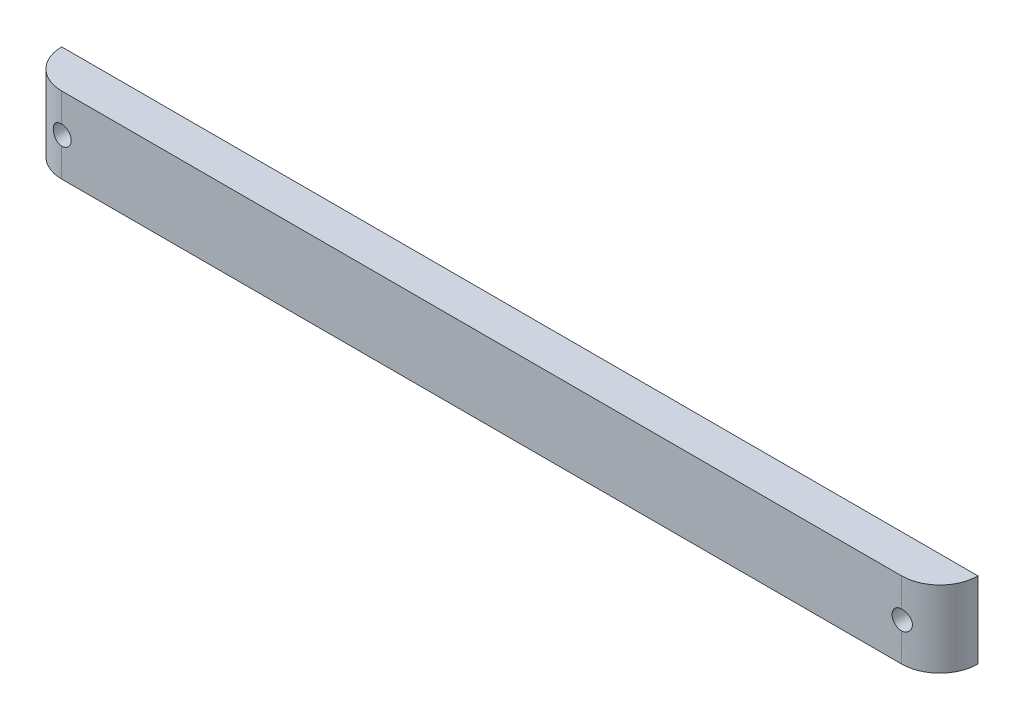
ISO-10303-21;
HEADER;
FILE_DESCRIPTION(('STEP AP214'),'2;1');
FILE_NAME('part.step','',(''),(''),'','','');
FILE_SCHEMA(('AUTOMOTIVE_DESIGN { 1 0 10303 214 1 1 1 1 }'));
ENDSEC;
DATA;
#1=APPLICATION_CONTEXT('core data for automotive mechanical design processes');
#2=APPLICATION_PROTOCOL_DEFINITION('international standard','automotive_design',2000,#1);
#3=PRODUCT_CONTEXT('',#1,'mechanical');
#4=PRODUCT('Part','Part','',(#3));
#5=PRODUCT_RELATED_PRODUCT_CATEGORY('part','',(#4));
#6=PRODUCT_DEFINITION_FORMATION('','',#4);
#7=PRODUCT_DEFINITION_CONTEXT('part definition',#1,'design');
#8=PRODUCT_DEFINITION('design','',#6,#7);
#9=PRODUCT_DEFINITION_SHAPE('','',#8);
#10=(LENGTH_UNIT() NAMED_UNIT(*) SI_UNIT(.MILLI.,.METRE.));
#11=(NAMED_UNIT(*) PLANE_ANGLE_UNIT() SI_UNIT($,.RADIAN.));
#12=(NAMED_UNIT(*) SI_UNIT($,.STERADIAN.) SOLID_ANGLE_UNIT());
#13=UNCERTAINTY_MEASURE_WITH_UNIT(LENGTH_MEASURE(1.E-05),#10,'distance_accuracy_value','');
#14=(GEOMETRIC_REPRESENTATION_CONTEXT(3) GLOBAL_UNCERTAINTY_ASSIGNED_CONTEXT((#13)) GLOBAL_UNIT_ASSIGNED_CONTEXT((#10,
#11,#12)) REPRESENTATION_CONTEXT('',''));
#15=CARTESIAN_POINT('',(0.,0.,0.));
#16=DIRECTION('',(0.,0.,1.));
#17=DIRECTION('',(1.,0.,0.));
#18=AXIS2_PLACEMENT_3D('',#15,#16,#17);
#19=CARTESIAN_POINT('',(0.,0.,10.));
#20=DIRECTION('',(0.,0.,-1.));
#21=DIRECTION('',(-1.,0.,0.));
#22=AXIS2_PLACEMENT_3D('',#19,#20,#21);
#23=PLANE('',#22);
#24=DIRECTION('',(1.,0.,0.));
#25=VECTOR('',#24,1.);
#26=CARTESIAN_POINT('',(0.,0.,10.));
#27=LINE('',#26,#25);
#28=CARTESIAN_POINT('',(10.,0.,10.));
#29=VERTEX_POINT('',#28);
#30=CARTESIAN_POINT('',(230.,0.,10.));
#31=VERTEX_POINT('',#30);
#32=EDGE_CURVE('E100',#29,#31,#27,.T.);
#33=ORIENTED_EDGE('',*,*,#32,.T.);
#34=DIRECTION('',(0.,1.,0.));
#35=VECTOR('',#34,1.);
#36=CARTESIAN_POINT('',(230.,0.,10.));
#37=LINE('',#36,#35);
#38=CARTESIAN_POINT('',(230.,7.50000000000001,10.));
#39=VERTEX_POINT('',#38);
#40=EDGE_CURVE('E134',#31,#39,#37,.T.);
#41=ORIENTED_EDGE('',*,*,#40,.T.);
#42=CARTESIAN_POINT('',(230.,10.,10.));
#43=DIRECTION('',(0.,0.,1.));
#44=DIRECTION('',(1.,0.,0.));
#45=AXIS2_PLACEMENT_3D('',#42,#43,#44);
#46=CIRCLE('',#45,2.5);
#47=CARTESIAN_POINT('',(230.,12.5,10.));
#48=VERTEX_POINT('',#47);
#49=EDGE_CURVE('E116',#48,#39,#46,.T.);
#50=ORIENTED_EDGE('',*,*,#49,.F.);
#51=DIRECTION('',(0.,1.,0.));
#52=VECTOR('',#51,1.);
#53=CARTESIAN_POINT('',(230.,0.,10.));
#54=LINE('',#53,#52);
#55=CARTESIAN_POINT('',(230.,20.,10.));
#56=VERTEX_POINT('',#55);
#57=EDGE_CURVE('E132',#48,#56,#54,.T.);
#58=ORIENTED_EDGE('',*,*,#57,.T.);
#59=DIRECTION('',(-1.,0.,0.));
#60=VECTOR('',#59,1.);
#61=CARTESIAN_POINT('',(0.,20.,10.));
#62=LINE('',#61,#60);
#63=CARTESIAN_POINT('',(10.,20.,10.));
#64=VERTEX_POINT('',#63);
#65=EDGE_CURVE('E122',#56,#64,#62,.T.);
#66=ORIENTED_EDGE('',*,*,#65,.T.);
#67=DIRECTION('',(0.,-1.,0.));
#68=VECTOR('',#67,1.);
#69=CARTESIAN_POINT('',(10.,0.,10.));
#70=LINE('',#69,#68);
#71=CARTESIAN_POINT('',(10.,12.5,10.));
#72=VERTEX_POINT('',#71);
#73=EDGE_CURVE('E130',#64,#72,#70,.T.);
#74=ORIENTED_EDGE('',*,*,#73,.T.);
#75=CARTESIAN_POINT('',(10.,10.,10.));
#76=DIRECTION('',(0.,0.,1.));
#77=DIRECTION('',(1.,0.,0.));
#78=AXIS2_PLACEMENT_3D('',#75,#76,#77);
#79=CIRCLE('',#78,2.5);
#80=CARTESIAN_POINT('',(10.,7.50000000000002,10.));
#81=VERTEX_POINT('',#80);
#82=EDGE_CURVE('E174',#81,#72,#79,.T.);
#83=ORIENTED_EDGE('',*,*,#82,.F.);
#84=DIRECTION('',(0.,-1.,0.));
#85=VECTOR('',#84,1.);
#86=CARTESIAN_POINT('',(10.,0.,10.));
#87=LINE('',#86,#85);
#88=EDGE_CURVE('E128',#81,#29,#87,.T.);
#89=ORIENTED_EDGE('',*,*,#88,.T.);
#90=EDGE_LOOP('',(#33,#41,#50,#58,#66,#74,#83,#89));
#91=FACE_BOUND('',#90,.T.);
#92=ADVANCED_FACE('F37',(#91),#23,.F.);
#93=CARTESIAN_POINT('',(0.,0.,0.));
#94=DIRECTION('',(0.,0.,-1.));
#95=DIRECTION('',(-1.,0.,0.));
#96=AXIS2_PLACEMENT_3D('',#93,#94,#95);
#97=PLANE('',#96);
#98=CARTESIAN_POINT('',(230.,10.,0.));
#99=DIRECTION('',(0.,0.,1.));
#100=DIRECTION('',(1.,0.,0.));
#101=AXIS2_PLACEMENT_3D('',#98,#99,#100);
#102=CIRCLE('',#101,2.5);
#103=CARTESIAN_POINT('',(232.5,10.,0.));
#104=VERTEX_POINT('',#103);
#105=EDGE_CURVE('E119',#104,#104,#102,.T.);
#106=ORIENTED_EDGE('',*,*,#105,.T.);
#107=EDGE_LOOP('',(#106));
#108=FACE_BOUND('',#107,.T.);
#109=DIRECTION('',(0.,-1.,0.));
#110=VECTOR('',#109,1.);
#111=CARTESIAN_POINT('',(0.,0.,0.));
#112=LINE('',#111,#110);
#113=CARTESIAN_POINT('',(0.,20.,0.));
#114=VERTEX_POINT('',#113);
#115=CARTESIAN_POINT('',(0.,0.,0.));
#116=VERTEX_POINT('',#115);
#117=EDGE_CURVE('E109',#114,#116,#112,.T.);
#118=ORIENTED_EDGE('',*,*,#117,.F.);
#119=DIRECTION('',(-1.,0.,0.));
#120=VECTOR('',#119,1.);
#121=CARTESIAN_POINT('',(0.,20.,0.));
#122=LINE('',#121,#120);
#123=CARTESIAN_POINT('',(240.,20.,0.));
#124=VERTEX_POINT('',#123);
#125=EDGE_CURVE('E126',#124,#114,#122,.T.);
#126=ORIENTED_EDGE('',*,*,#125,.F.);
#127=DIRECTION('',(0.,1.,0.));
#128=VECTOR('',#127,1.);
#129=CARTESIAN_POINT('',(240.,0.,0.));
#130=LINE('',#129,#128);
#131=CARTESIAN_POINT('',(240.,0.,0.));
#132=VERTEX_POINT('',#131);
#133=EDGE_CURVE('E112',#132,#124,#130,.T.);
#134=ORIENTED_EDGE('',*,*,#133,.F.);
#135=DIRECTION('',(1.,0.,0.));
#136=VECTOR('',#135,1.);
#137=CARTESIAN_POINT('',(0.,0.,0.));
#138=LINE('',#137,#136);
#139=EDGE_CURVE('E97',#116,#132,#138,.T.);
#140=ORIENTED_EDGE('',*,*,#139,.F.);
#141=EDGE_LOOP('',(#118,#126,#134,#140));
#142=FACE_BOUND('',#141,.T.);
#143=CARTESIAN_POINT('',(10.,10.,0.));
#144=DIRECTION('',(0.,0.,1.));
#145=DIRECTION('',(1.,0.,0.));
#146=AXIS2_PLACEMENT_3D('',#143,#144,#145);
#147=CIRCLE('',#146,2.5);
#148=CARTESIAN_POINT('',(12.5,10.,0.));
#149=VERTEX_POINT('',#148);
#150=EDGE_CURVE('E176',#149,#149,#147,.T.);
#151=ORIENTED_EDGE('',*,*,#150,.T.);
#152=EDGE_LOOP('',(#151));
#153=FACE_BOUND('',#152,.T.);
#154=ADVANCED_FACE('F106',(#108,#142,#153),#97,.T.);
#155=CARTESIAN_POINT('',(0.,0.,10.));
#156=DIRECTION('',(0.,1.,0.));
#157=DIRECTION('',(0.,0.,1.));
#158=AXIS2_PLACEMENT_3D('',#155,#156,#157);
#159=PLANE('',#158);
#160=ORIENTED_EDGE('',*,*,#139,.T.);
#161=CARTESIAN_POINT('',(230.,0.,0.));
#162=DIRECTION('',(0.,1.,0.));
#163=DIRECTION('',(0.,0.,1.));
#164=AXIS2_PLACEMENT_3D('',#161,#162,#163);
#165=CIRCLE('',#164,10.);
#166=EDGE_CURVE('E51',#132,#31,#165,.F.);
#167=ORIENTED_EDGE('',*,*,#166,.T.);
#168=ORIENTED_EDGE('',*,*,#32,.F.);
#169=CARTESIAN_POINT('',(10.,0.,0.));
#170=DIRECTION('',(0.,1.,0.));
#171=DIRECTION('',(0.,0.,1.));
#172=AXIS2_PLACEMENT_3D('',#169,#170,#171);
#173=CIRCLE('',#172,10.);
#174=EDGE_CURVE('E94',#29,#116,#173,.F.);
#175=ORIENTED_EDGE('',*,*,#174,.T.);
#176=EDGE_LOOP('',(#160,#167,#168,#175));
#177=FACE_BOUND('',#176,.T.);
#178=ADVANCED_FACE('F96',(#177),#159,.F.);
#179=CARTESIAN_POINT('',(0.,20.,10.));
#180=DIRECTION('',(0.,-1.,0.));
#181=DIRECTION('',(0.,0.,-1.));
#182=AXIS2_PLACEMENT_3D('',#179,#180,#181);
#183=PLANE('',#182);
#184=ORIENTED_EDGE('',*,*,#65,.F.);
#185=CARTESIAN_POINT('',(230.,20.,0.));
#186=DIRECTION('',(0.,-1.,0.));
#187=DIRECTION('',(0.,0.,-1.));
#188=AXIS2_PLACEMENT_3D('',#185,#186,#187);
#189=CIRCLE('',#188,10.);
#190=EDGE_CURVE('E102',#56,#124,#189,.F.);
#191=ORIENTED_EDGE('',*,*,#190,.T.);
#192=ORIENTED_EDGE('',*,*,#125,.T.);
#193=CARTESIAN_POINT('',(10.,20.,0.));
#194=DIRECTION('',(0.,-1.,0.));
#195=DIRECTION('',(0.,0.,-1.));
#196=AXIS2_PLACEMENT_3D('',#193,#194,#195);
#197=CIRCLE('',#196,10.);
#198=EDGE_CURVE('E115',#114,#64,#197,.F.);
#199=ORIENTED_EDGE('',*,*,#198,.T.);
#200=EDGE_LOOP('',(#184,#191,#192,#199));
#201=FACE_BOUND('',#200,.T.);
#202=ADVANCED_FACE('F156',(#201),#183,.F.);
#203=CARTESIAN_POINT('',(230.,10.,10.));
#204=DIRECTION('',(0.,0.,-1.));
#205=DIRECTION('',(-1.,0.,0.));
#206=AXIS2_PLACEMENT_3D('',#203,#204,#205);
#207=CYLINDRICAL_SURFACE('',#206,2.5);
#208=ORIENTED_EDGE('',*,*,#49,.T.);
#209=CARTESIAN_POINT('',(230.,7.50000000000001,10.));
#210=CARTESIAN_POINT('',(230.069171983121,7.49999207155217,10.0000068284851));
#211=CARTESIAN_POINT('',(230.138339407412,7.5028707447773,9.99928243893917));
#212=CARTESIAN_POINT('',(230.276159242373,7.51433978820842,9.9964218717532));
#213=CARTESIAN_POINT('',(230.344811731462,7.52292927009875,9.99428591368279));
#214=CARTESIAN_POINT('',(230.480988170203,7.54573677857049,9.98865817798583));
#215=CARTESIAN_POINT('',(230.548514015755,7.55994408309909,9.98516898335865));
#216=CARTESIAN_POINT('',(230.682073893017,7.59385602431221,9.9769364516676));
#217=CARTESIAN_POINT('',(230.748107908888,7.6135607193339,9.97219310129492));
#218=CARTESIAN_POINT('',(230.943276473751,7.68070840819373,9.95626391693538));
#219=CARTESIAN_POINT('',(231.069606352072,7.73620677431153,9.94337327035912));
#220=CARTESIAN_POINT('',(231.311118373598,7.86695916042346,9.9144249411367));
#221=CARTESIAN_POINT('',(231.426297920398,7.9422177666049,9.89836652349269));
#222=CARTESIAN_POINT('',(231.644660004745,8.11199672601071,9.86445770558258));
#223=CARTESIAN_POINT('',(231.747583614741,8.20684518989344,9.84657982974855));
#224=CARTESIAN_POINT('',(231.936243381944,8.41241248605538,9.81122825431225));
#225=CARTESIAN_POINT('',(232.02197632193,8.52313428237792,9.79375463090578));
#226=CARTESIAN_POINT('',(232.175045803433,8.75932834430006,9.76091251484304));
#227=CARTESIAN_POINT('',(232.242090368101,8.88499517438722,9.7455791222073));
#228=CARTESIAN_POINT('',(232.353997277596,9.14625436998783,9.71915766992874));
#229=CARTESIAN_POINT('',(232.398864307053,9.28184463239124,9.70806871383239));
#230=CARTESIAN_POINT('',(232.464257663936,9.55623761492639,9.6916747048277));
#231=CARTESIAN_POINT('',(232.485253299047,9.69492168102769,9.68625830511024));
#232=CARTESIAN_POINT('',(232.503769686954,9.9739444383475,9.68148936061101));
#233=CARTESIAN_POINT('',(232.501293729179,10.1142828949581,9.68213596612862));
#234=CARTESIAN_POINT('',(232.473310812882,10.3890269570858,9.68932010779816));
#235=CARTESIAN_POINT('',(232.44836368401,10.523493911289,9.69571444141657));
#236=CARTESIAN_POINT('',(232.377039886674,10.7862695713833,9.7134452625222));
#237=CARTESIAN_POINT('',(232.330661883494,10.9145778931647,9.72478205782392));
#238=CARTESIAN_POINT('',(232.217315161994,11.1628981578527,9.75125205530432));
#239=CARTESIAN_POINT('',(232.150142996268,11.2828131010223,9.76642248324309));
#240=CARTESIAN_POINT('',(231.997258305793,11.5098670527906,9.79882891938065));
#241=CARTESIAN_POINT('',(231.911542971772,11.6170041217345,9.81606524038355));
#242=CARTESIAN_POINT('',(231.721117156661,11.8186610790887,9.85126265828291));
#243=CARTESIAN_POINT('',(231.615936206313,11.9127360395525,9.86923043413656));
#244=CARTESIAN_POINT('',(231.391045165335,12.0820183995616,9.90342904856615));
#245=CARTESIAN_POINT('',(231.27133134905,12.1572209457417,9.91965943972969));
#246=CARTESIAN_POINT('',(231.020119682466,12.2867921682899,9.94863823256449));
#247=CARTESIAN_POINT('',(230.888577011898,12.3410770983701,9.96137258010972));
#248=CARTESIAN_POINT('',(230.617921192334,12.4265704687375,9.98180829547256));
#249=CARTESIAN_POINT('',(230.478819454053,12.4578127079981,9.98951703290944));
#250=CARTESIAN_POINT('',(230.282096959896,12.4846810756458,9.99617944530655));
#251=CARTESIAN_POINT('',(230.225792724018,12.4904267820569,9.99761025174265));
#252=CARTESIAN_POINT('',(230.113001226626,12.498081882109,9.9995200096046));
#253=CARTESIAN_POINT('',(230.056514419743,12.4999975832977,10.0000005260271));
#254=CARTESIAN_POINT('',(230.,12.5,10.));
#255=B_SPLINE_CURVE_WITH_KNOTS('',3,(#209,#210,#211,#212,#213,#214,#215,#216,#217,#218,#219,
#220,#221,#222,#223,#224,#225,#226,#227,#228,#229,#230,#231,#232,#233,#234,#235,#236,#237,#238,
#239,#240,#241,#242,#243,#244,#245,#246,#247,#248,#249,#250,#251,#252,#253,#254),.UNSPECIFIED.,
.F.,.F.,(4,2,2,2,2,2,2,2,2,2,2,2,2,2,2,2,2,2,2,2,2,2,4),(0.,0.207444392168157,0.414856523930368,
0.62187468952106,0.828895052029226,1.24254842673385,1.65629789193883,2.07763963139776,
2.49906015115031,2.92673643717073,3.35432234517622,3.77334818145836,4.19231529419041,
4.60112477334778,5.00995971663057,5.42292830716784,5.83595950590655,6.26072493222843,
6.68559948258471,7.1121578222439,7.53808923584228,7.7078228593857,7.87727672149712),.UNSPECIFIED.);
#256=EDGE_CURVE('E137',#39,#48,#255,.T.);
#257=ORIENTED_EDGE('',*,*,#256,.T.);
#258=EDGE_LOOP('',(#208,#257));
#259=FACE_BOUND('',#258,.T.);
#260=ORIENTED_EDGE('',*,*,#105,.F.);
#261=EDGE_LOOP('',(#260));
#262=FACE_BOUND('',#261,.T.);
#263=ADVANCED_FACE('F145',(#259,#262),#207,.F.);
#264=CARTESIAN_POINT('',(10.,10.,10.));
#265=DIRECTION('',(0.,0.,-1.));
#266=DIRECTION('',(-1.,0.,0.));
#267=AXIS2_PLACEMENT_3D('',#264,#265,#266);
#268=CYLINDRICAL_SURFACE('',#267,2.5);
#269=ORIENTED_EDGE('',*,*,#82,.T.);
#270=CARTESIAN_POINT('',(10.,12.5,10.));
#271=CARTESIAN_POINT('',(9.93082801687919,12.5000079284479,10.0000068284851));
#272=CARTESIAN_POINT('',(9.86166059258827,12.4971292552227,9.99928243893917));
#273=CARTESIAN_POINT('',(9.72384075762713,12.4856602117916,9.9964218717532));
#274=CARTESIAN_POINT('',(9.6551882685381,12.4770707299013,9.99428591368279));
#275=CARTESIAN_POINT('',(9.51901182979725,12.4542632214295,9.98865817798583));
#276=CARTESIAN_POINT('',(9.45148598424494,12.4400559169009,9.98516898335865));
#277=CARTESIAN_POINT('',(9.31792610698283,12.4061439756878,9.9769364516676));
#278=CARTESIAN_POINT('',(9.25189209111205,12.3864392806661,9.97219310129492));
#279=CARTESIAN_POINT('',(9.05672352624922,12.3192915918063,9.95626391693538));
#280=CARTESIAN_POINT('',(8.93039364792803,12.2637932256885,9.94337327035912));
#281=CARTESIAN_POINT('',(8.68888162640233,12.1330408395766,9.9144249411367));
#282=CARTESIAN_POINT('',(8.57370207960195,12.0577822333951,9.89836652349269));
#283=CARTESIAN_POINT('',(8.35533999525519,11.8880032739893,9.86445770558258));
#284=CARTESIAN_POINT('',(8.25241638525867,11.7931548101066,9.84657982974854));
#285=CARTESIAN_POINT('',(8.06375661805637,11.5875875139446,9.81122825431225));
#286=CARTESIAN_POINT('',(7.97802367806957,11.4768657176221,9.79375463090578));
#287=CARTESIAN_POINT('',(7.82495419656656,11.2406716557,9.76091251484304));
#288=CARTESIAN_POINT('',(7.75790963189922,11.1150048256128,9.7455791222073));
#289=CARTESIAN_POINT('',(7.64600272240378,10.8537456300122,9.71915766992874));
#290=CARTESIAN_POINT('',(7.60113569294719,10.7181553676088,9.70806871383239));
#291=CARTESIAN_POINT('',(7.53574233606354,10.4437623850736,9.6916747048277));
#292=CARTESIAN_POINT('',(7.51474670095282,10.3050783189723,9.68625830511024));
#293=CARTESIAN_POINT('',(7.4962303130459,10.0260555616525,9.68148936061101));
#294=CARTESIAN_POINT('',(7.49870627082094,9.88571710504195,9.68213596612862));
#295=CARTESIAN_POINT('',(7.52668918711762,9.61097304291424,9.68932010779816));
#296=CARTESIAN_POINT('',(7.55163631599032,9.476506088711,9.69571444141657));
#297=CARTESIAN_POINT('',(7.62296011332615,9.21373042861669,9.7134452625222));
#298=CARTESIAN_POINT('',(7.66933811650617,9.08542210683533,9.72478205782392));
#299=CARTESIAN_POINT('',(7.78268483800562,8.8371018421473,9.75125205530432));
#300=CARTESIAN_POINT('',(7.84985700373195,8.71718689897773,9.76642248324309));
#301=CARTESIAN_POINT('',(8.00274169420705,8.49013294720945,9.79882891938065));
#302=CARTESIAN_POINT('',(8.08845702822747,8.38299587826549,9.81606524038355));
#303=CARTESIAN_POINT('',(8.27888284333891,8.18133892091137,9.85126265828291));
#304=CARTESIAN_POINT('',(8.38406379368745,8.0872639604475,9.86923043413656));
#305=CARTESIAN_POINT('',(8.608954834665,7.9179816004384,9.90342904856615));
#306=CARTESIAN_POINT('',(8.72866865094967,7.8427790542583,9.91965943972969));
#307=CARTESIAN_POINT('',(8.97988031753349,7.71320783171014,9.94863823256449));
#308=CARTESIAN_POINT('',(9.11142298810203,7.65892290162991,9.96137258010972));
#309=CARTESIAN_POINT('',(9.3820788076658,7.57342953126254,9.98180829547255));
#310=CARTESIAN_POINT('',(9.52118054594682,7.5421872920019,9.98951703290943));
#311=CARTESIAN_POINT('',(9.71790304010376,7.51531892435417,9.99617944530655));
#312=CARTESIAN_POINT('',(9.7742072759816,7.50957321794309,9.99761025174265));
#313=CARTESIAN_POINT('',(9.88699877337377,7.50191811789102,9.9995200096046));
#314=CARTESIAN_POINT('',(9.94348558025717,7.50000241670229,10.0000005260271));
#315=CARTESIAN_POINT('',(10.,7.5,10.));
#316=B_SPLINE_CURVE_WITH_KNOTS('',3,(#270,#271,#272,#273,#274,#275,#276,#277,#278,#279,#280,
#281,#282,#283,#284,#285,#286,#287,#288,#289,#290,#291,#292,#293,#294,#295,#296,#297,#298,#299,
#300,#301,#302,#303,#304,#305,#306,#307,#308,#309,#310,#311,#312,#313,#314,#315),.UNSPECIFIED.,
.F.,.F.,(4,2,2,2,2,2,2,2,2,2,2,2,2,2,2,2,2,2,2,2,2,2,4),(0.,0.207444392168178,0.414856523930359,
0.621874689521047,0.828895052029221,1.24254842673381,1.65629789193884,2.07763963139779,
2.49906015115029,2.92673643717074,3.35432234517622,3.77334818145836,4.19231529419041,
4.60112477334779,5.00995971663058,5.42292830716783,5.83595950590656,6.26072493222844,
6.68559948258472,7.11215782224389,7.53808923584228,7.7078228593857,7.87727672149716),.UNSPECIFIED.);
#317=EDGE_CURVE('E11',#72,#81,#316,.T.);
#318=ORIENTED_EDGE('',*,*,#317,.T.);
#319=EDGE_LOOP('',(#269,#318));
#320=FACE_BOUND('',#319,.T.);
#321=ORIENTED_EDGE('',*,*,#150,.F.);
#322=EDGE_LOOP('',(#321));
#323=FACE_BOUND('',#322,.T.);
#324=ADVANCED_FACE('F152',(#320,#323),#268,.F.);
#325=CARTESIAN_POINT('',(230.,0.,0.));
#326=DIRECTION('',(0.,1.,0.));
#327=DIRECTION('',(0.,0.,1.));
#328=AXIS2_PLACEMENT_3D('',#325,#326,#327);
#329=CYLINDRICAL_SURFACE('',#328,10.);
#330=ORIENTED_EDGE('',*,*,#166,.F.);
#331=ORIENTED_EDGE('',*,*,#133,.T.);
#332=ORIENTED_EDGE('',*,*,#190,.F.);
#333=ORIENTED_EDGE('',*,*,#57,.F.);
#334=ORIENTED_EDGE('',*,*,#256,.F.);
#335=ORIENTED_EDGE('',*,*,#40,.F.);
#336=EDGE_LOOP('',(#330,#331,#332,#333,#334,#335));
#337=FACE_BOUND('',#336,.T.);
#338=ADVANCED_FACE('F148',(#337),#329,.T.);
#339=CARTESIAN_POINT('',(10.,0.,0.));
#340=DIRECTION('',(0.,-1.,0.));
#341=DIRECTION('',(0.,0.,-1.));
#342=AXIS2_PLACEMENT_3D('',#339,#340,#341);
#343=CYLINDRICAL_SURFACE('',#342,10.);
#344=ORIENTED_EDGE('',*,*,#198,.F.);
#345=ORIENTED_EDGE('',*,*,#117,.T.);
#346=ORIENTED_EDGE('',*,*,#174,.F.);
#347=ORIENTED_EDGE('',*,*,#88,.F.);
#348=ORIENTED_EDGE('',*,*,#317,.F.);
#349=ORIENTED_EDGE('',*,*,#73,.F.);
#350=EDGE_LOOP('',(#344,#345,#346,#347,#348,#349));
#351=FACE_BOUND('',#350,.T.);
#352=ADVANCED_FACE('F39',(#351),#343,.T.);
#353=CLOSED_SHELL('',(#92,#154,#178,#202,#263,#324,#338,#352));
#354=MANIFOLD_SOLID_BREP('B2',#353);
#355=ADVANCED_BREP_SHAPE_REPRESENTATION('',(#18,#354),#14);
#356=SHAPE_DEFINITION_REPRESENTATION(#9,#355);
ENDSEC;
END-ISO-10303-21;
